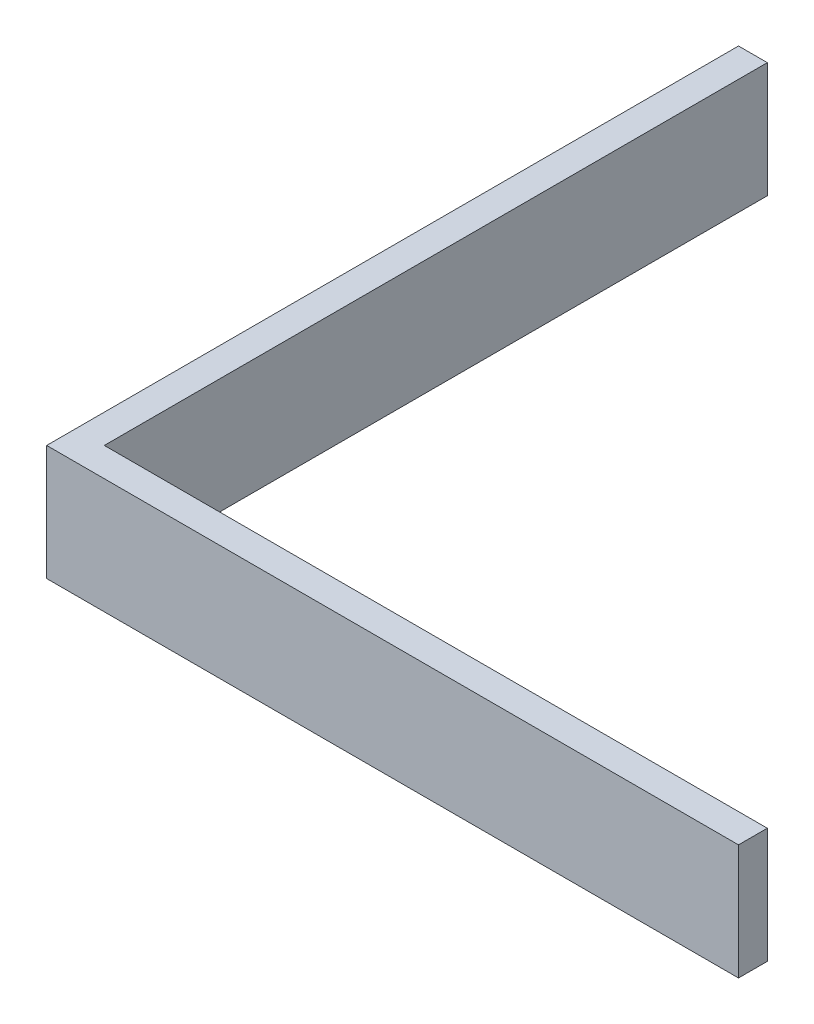
ISO-10303-21;
HEADER;
FILE_DESCRIPTION(('STEP AP214'),'2;1');
FILE_NAME('part.step','',(''),(''),'','','');
FILE_SCHEMA(('AUTOMOTIVE_DESIGN { 1 0 10303 214 1 1 1 1 }'));
ENDSEC;
DATA;
#1=APPLICATION_CONTEXT('core data for automotive mechanical design processes');
#2=APPLICATION_PROTOCOL_DEFINITION('international standard','automotive_design',2000,#1);
#3=PRODUCT_CONTEXT('',#1,'mechanical');
#4=PRODUCT('Part','Part','',(#3));
#5=PRODUCT_RELATED_PRODUCT_CATEGORY('part','',(#4));
#6=PRODUCT_DEFINITION_FORMATION('','',#4);
#7=PRODUCT_DEFINITION_CONTEXT('part definition',#1,'design');
#8=PRODUCT_DEFINITION('design','',#6,#7);
#9=PRODUCT_DEFINITION_SHAPE('','',#8);
#10=(LENGTH_UNIT() NAMED_UNIT(*) SI_UNIT(.MILLI.,.METRE.));
#11=(NAMED_UNIT(*) PLANE_ANGLE_UNIT() SI_UNIT($,.RADIAN.));
#12=(NAMED_UNIT(*) SI_UNIT($,.STERADIAN.) SOLID_ANGLE_UNIT());
#13=UNCERTAINTY_MEASURE_WITH_UNIT(LENGTH_MEASURE(1.E-05),#10,'distance_accuracy_value','');
#14=(GEOMETRIC_REPRESENTATION_CONTEXT(3) GLOBAL_UNCERTAINTY_ASSIGNED_CONTEXT((#13)) GLOBAL_UNIT_ASSIGNED_CONTEXT((#10,
#11,#12)) REPRESENTATION_CONTEXT('',''));
#15=CARTESIAN_POINT('',(0.,0.,0.));
#16=DIRECTION('',(0.,0.,1.));
#17=DIRECTION('',(1.,0.,0.));
#18=AXIS2_PLACEMENT_3D('',#15,#16,#17);
#19=CARTESIAN_POINT('',(0.,-10.,0.));
#20=DIRECTION('',(0.,-1.,0.));
#21=DIRECTION('',(0.,0.,-1.));
#22=AXIS2_PLACEMENT_3D('',#19,#20,#21);
#23=PLANE('',#22);
#24=DIRECTION('',(-1.,0.,0.));
#25=VECTOR('',#24,1.);
#26=CARTESIAN_POINT('',(27.9611650485437,-10.,19.5145631067961));
#27=LINE('',#26,#25);
#28=CARTESIAN_POINT('',(27.9611650485437,-10.,19.5145631067961));
#29=VERTEX_POINT('',#28);
#30=CARTESIAN_POINT('',(-32.0388349514563,-10.,19.5145631067961));
#31=VERTEX_POINT('',#30);
#32=EDGE_CURVE('E40',#29,#31,#27,.T.);
#33=ORIENTED_EDGE('',*,*,#32,.T.);
#34=DIRECTION('',(0.,0.,-1.));
#35=VECTOR('',#34,1.);
#36=CARTESIAN_POINT('',(-32.0388349514563,-10.,19.5145631067961));
#37=LINE('',#36,#35);
#38=CARTESIAN_POINT('',(-32.0388349514563,-10.,-40.4854368932039));
#39=VERTEX_POINT('',#38);
#40=EDGE_CURVE('E103',#31,#39,#37,.T.);
#41=ORIENTED_EDGE('',*,*,#40,.T.);
#42=DIRECTION('',(1.,0.,0.));
#43=VECTOR('',#42,1.);
#44=CARTESIAN_POINT('',(-32.0388349514563,-10.,-40.4854368932039));
#45=LINE('',#44,#43);
#46=CARTESIAN_POINT('',(-29.5388349514563,-10.,-40.4854368932039));
#47=VERTEX_POINT('',#46);
#48=EDGE_CURVE('E105',#39,#47,#45,.T.);
#49=ORIENTED_EDGE('',*,*,#48,.T.);
#50=DIRECTION('',(0.,0.,1.));
#51=VECTOR('',#50,1.);
#52=CARTESIAN_POINT('',(-29.5388349514563,-10.,-40.4854368932039));
#53=LINE('',#52,#51);
#54=CARTESIAN_POINT('',(-29.5388349514563,-10.,17.0145631067961));
#55=VERTEX_POINT('',#54);
#56=EDGE_CURVE('E121',#47,#55,#53,.T.);
#57=ORIENTED_EDGE('',*,*,#56,.T.);
#58=DIRECTION('',(1.,0.,0.));
#59=VECTOR('',#58,1.);
#60=CARTESIAN_POINT('',(-29.5388349514563,-10.,17.0145631067961));
#61=LINE('',#60,#59);
#62=CARTESIAN_POINT('',(27.9611650485437,-10.,17.0145631067961));
#63=VERTEX_POINT('',#62);
#64=EDGE_CURVE('E46',#55,#63,#61,.T.);
#65=ORIENTED_EDGE('',*,*,#64,.T.);
#66=DIRECTION('',(0.,0.,1.));
#67=VECTOR('',#66,1.);
#68=CARTESIAN_POINT('',(27.9611650485437,-10.,17.0145631067961));
#69=LINE('',#68,#67);
#70=EDGE_CURVE('E11',#63,#29,#69,.T.);
#71=ORIENTED_EDGE('',*,*,#70,.T.);
#72=EDGE_LOOP('',(#33,#41,#49,#57,#65,#71));
#73=FACE_BOUND('',#72,.T.);
#74=ADVANCED_FACE('F36',(#73),#23,.T.);
#75=CARTESIAN_POINT('',(-29.5388349514563,-10.,17.0145631067961));
#76=DIRECTION('',(0.,0.,1.));
#77=DIRECTION('',(1.,0.,0.));
#78=AXIS2_PLACEMENT_3D('',#75,#76,#77);
#79=PLANE('',#78);
#80=DIRECTION('',(1.,0.,0.));
#81=VECTOR('',#80,1.);
#82=CARTESIAN_POINT('',(-29.5388349514563,0.,17.0145631067961));
#83=LINE('',#82,#81);
#84=CARTESIAN_POINT('',(-29.5388349514563,0.,17.0145631067961));
#85=VERTEX_POINT('',#84);
#86=CARTESIAN_POINT('',(27.9611650485437,0.,17.0145631067961));
#87=VERTEX_POINT('',#86);
#88=EDGE_CURVE('E107',#85,#87,#83,.T.);
#89=ORIENTED_EDGE('',*,*,#88,.T.);
#90=DIRECTION('',(0.,1.,0.));
#91=VECTOR('',#90,1.);
#92=CARTESIAN_POINT('',(27.9611650485437,-10.,17.0145631067961));
#93=LINE('',#92,#91);
#94=EDGE_CURVE('E98',#63,#87,#93,.T.);
#95=ORIENTED_EDGE('',*,*,#94,.F.);
#96=ORIENTED_EDGE('',*,*,#64,.F.);
#97=DIRECTION('',(0.,1.,0.));
#98=VECTOR('',#97,1.);
#99=CARTESIAN_POINT('',(-29.5388349514563,-10.,17.0145631067961));
#100=LINE('',#99,#98);
#101=EDGE_CURVE('E104',#55,#85,#100,.T.);
#102=ORIENTED_EDGE('',*,*,#101,.T.);
#103=EDGE_LOOP('',(#89,#95,#96,#102));
#104=FACE_BOUND('',#103,.T.);
#105=ADVANCED_FACE('F134',(#104),#79,.F.);
#106=CARTESIAN_POINT('',(-29.5388349514563,-10.,-40.4854368932039));
#107=DIRECTION('',(-1.,0.,0.));
#108=DIRECTION('',(0.,0.,1.));
#109=AXIS2_PLACEMENT_3D('',#106,#107,#108);
#110=PLANE('',#109);
#111=DIRECTION('',(0.,0.,1.));
#112=VECTOR('',#111,1.);
#113=CARTESIAN_POINT('',(-29.5388349514563,0.,-40.4854368932039));
#114=LINE('',#113,#112);
#115=CARTESIAN_POINT('',(-29.5388349514563,0.,-40.4854368932039));
#116=VERTEX_POINT('',#115);
#117=EDGE_CURVE('E116',#116,#85,#114,.T.);
#118=ORIENTED_EDGE('',*,*,#117,.T.);
#119=ORIENTED_EDGE('',*,*,#101,.F.);
#120=ORIENTED_EDGE('',*,*,#56,.F.);
#121=DIRECTION('',(0.,1.,0.));
#122=VECTOR('',#121,1.);
#123=CARTESIAN_POINT('',(-29.5388349514563,-10.,-40.4854368932039));
#124=LINE('',#123,#122);
#125=EDGE_CURVE('E111',#47,#116,#124,.T.);
#126=ORIENTED_EDGE('',*,*,#125,.T.);
#127=EDGE_LOOP('',(#118,#119,#120,#126));
#128=FACE_BOUND('',#127,.T.);
#129=ADVANCED_FACE('F133',(#128),#110,.F.);
#130=CARTESIAN_POINT('',(-32.0388349514563,5.,-40.4854368932039));
#131=DIRECTION('',(0.,0.,1.));
#132=DIRECTION('',(1.,0.,0.));
#133=AXIS2_PLACEMENT_3D('',#130,#131,#132);
#134=PLANE('',#133);
#135=DIRECTION('',(0.,-1.,0.));
#136=VECTOR('',#135,1.);
#137=CARTESIAN_POINT('',(-32.0388349514563,5.,-40.4854368932039));
#138=LINE('',#137,#136);
#139=CARTESIAN_POINT('',(-32.0388349514563,0.,-40.4854368932039));
#140=VERTEX_POINT('',#139);
#141=EDGE_CURVE('E70',#140,#39,#138,.T.);
#142=ORIENTED_EDGE('',*,*,#141,.F.);
#143=DIRECTION('',(1.,0.,0.));
#144=VECTOR('',#143,1.);
#145=CARTESIAN_POINT('',(-32.0388349514563,0.,-40.4854368932039));
#146=LINE('',#145,#144);
#147=EDGE_CURVE('E131',#140,#116,#146,.T.);
#148=ORIENTED_EDGE('',*,*,#147,.T.);
#149=ORIENTED_EDGE('',*,*,#125,.F.);
#150=ORIENTED_EDGE('',*,*,#48,.F.);
#151=EDGE_LOOP('',(#142,#148,#149,#150));
#152=FACE_BOUND('',#151,.T.);
#153=ADVANCED_FACE('F129',(#152),#134,.F.);
#154=CARTESIAN_POINT('',(27.9611650485437,5.,19.5145631067961));
#155=DIRECTION('',(-1.,0.,0.));
#156=DIRECTION('',(0.,0.,1.));
#157=AXIS2_PLACEMENT_3D('',#154,#155,#156);
#158=PLANE('',#157);
#159=ORIENTED_EDGE('',*,*,#94,.T.);
#160=DIRECTION('',(0.,0.,1.));
#161=VECTOR('',#160,1.);
#162=CARTESIAN_POINT('',(27.9611650485437,0.,19.5145631067961));
#163=LINE('',#162,#161);
#164=CARTESIAN_POINT('',(27.9611650485437,0.,19.5145631067961));
#165=VERTEX_POINT('',#164);
#166=EDGE_CURVE('E87',#87,#165,#163,.T.);
#167=ORIENTED_EDGE('',*,*,#166,.T.);
#168=DIRECTION('',(0.,-1.,0.));
#169=VECTOR('',#168,1.);
#170=CARTESIAN_POINT('',(27.9611650485437,5.,19.5145631067961));
#171=LINE('',#170,#169);
#172=EDGE_CURVE('E93',#165,#29,#171,.T.);
#173=ORIENTED_EDGE('',*,*,#172,.T.);
#174=ORIENTED_EDGE('',*,*,#70,.F.);
#175=EDGE_LOOP('',(#159,#167,#173,#174));
#176=FACE_BOUND('',#175,.T.);
#177=ADVANCED_FACE('F95',(#176),#158,.F.);
#178=CARTESIAN_POINT('',(-32.0388349514563,5.,19.5145631067961));
#179=DIRECTION('',(0.,0.,-1.));
#180=DIRECTION('',(-1.,0.,0.));
#181=AXIS2_PLACEMENT_3D('',#178,#179,#180);
#182=PLANE('',#181);
#183=ORIENTED_EDGE('',*,*,#172,.F.);
#184=DIRECTION('',(-1.,0.,0.));
#185=VECTOR('',#184,1.);
#186=CARTESIAN_POINT('',(-32.0388349514563,0.,19.5145631067961));
#187=LINE('',#186,#185);
#188=CARTESIAN_POINT('',(-32.0388349514563,0.,19.5145631067961));
#189=VERTEX_POINT('',#188);
#190=EDGE_CURVE('E80',#165,#189,#187,.T.);
#191=ORIENTED_EDGE('',*,*,#190,.T.);
#192=DIRECTION('',(0.,-1.,0.));
#193=VECTOR('',#192,1.);
#194=CARTESIAN_POINT('',(-32.0388349514563,5.,19.5145631067961));
#195=LINE('',#194,#193);
#196=EDGE_CURVE('E99',#189,#31,#195,.T.);
#197=ORIENTED_EDGE('',*,*,#196,.T.);
#198=ORIENTED_EDGE('',*,*,#32,.F.);
#199=EDGE_LOOP('',(#183,#191,#197,#198));
#200=FACE_BOUND('',#199,.T.);
#201=ADVANCED_FACE('F38',(#200),#182,.F.);
#202=CARTESIAN_POINT('',(-32.0388349514563,5.,19.5145631067961));
#203=DIRECTION('',(1.,0.,0.));
#204=DIRECTION('',(0.,0.,-1.));
#205=AXIS2_PLACEMENT_3D('',#202,#203,#204);
#206=PLANE('',#205);
#207=ORIENTED_EDGE('',*,*,#196,.F.);
#208=DIRECTION('',(0.,0.,-1.));
#209=VECTOR('',#208,1.);
#210=CARTESIAN_POINT('',(-32.0388349514563,0.,-44.9701373124576));
#211=LINE('',#210,#209);
#212=EDGE_CURVE('E140',#189,#140,#211,.T.);
#213=ORIENTED_EDGE('',*,*,#212,.T.);
#214=ORIENTED_EDGE('',*,*,#141,.T.);
#215=ORIENTED_EDGE('',*,*,#40,.F.);
#216=EDGE_LOOP('',(#207,#213,#214,#215));
#217=FACE_BOUND('',#216,.T.);
#218=ADVANCED_FACE('F143',(#217),#206,.F.);
#219=CARTESIAN_POINT('',(-32.0388349514563,0.,-44.9701373124576));
#220=DIRECTION('',(0.,-1.,0.));
#221=DIRECTION('',(0.,0.,-1.));
#222=AXIS2_PLACEMENT_3D('',#219,#220,#221);
#223=PLANE('',#222);
#224=ORIENTED_EDGE('',*,*,#212,.F.);
#225=ORIENTED_EDGE('',*,*,#190,.F.);
#226=ORIENTED_EDGE('',*,*,#166,.F.);
#227=ORIENTED_EDGE('',*,*,#88,.F.);
#228=ORIENTED_EDGE('',*,*,#117,.F.);
#229=ORIENTED_EDGE('',*,*,#147,.F.);
#230=EDGE_LOOP('',(#224,#225,#226,#227,#228,#229));
#231=FACE_BOUND('',#230,.T.);
#232=ADVANCED_FACE('F135',(#231),#223,.F.);
#233=CLOSED_SHELL('',(#74,#105,#129,#153,#177,#201,#218,#232));
#234=MANIFOLD_SOLID_BREP('B2',#233);
#235=ADVANCED_BREP_SHAPE_REPRESENTATION('',(#18,#234),#14);
#236=SHAPE_DEFINITION_REPRESENTATION(#9,#235);
ENDSEC;
END-ISO-10303-21;
